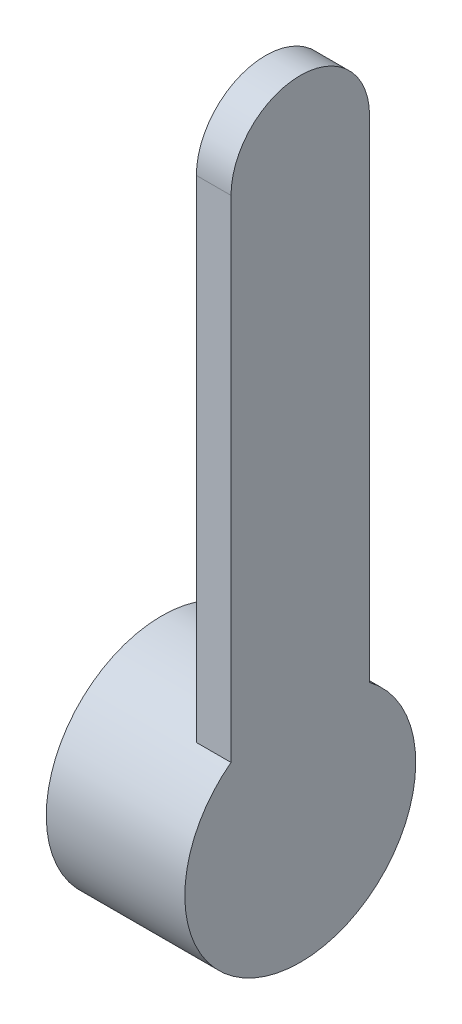
ISO-10303-21;
HEADER;
FILE_DESCRIPTION(('STEP AP214'),'2;1');
FILE_NAME('part.step','',(''),(''),'','','');
FILE_SCHEMA(('AUTOMOTIVE_DESIGN { 1 0 10303 214 1 1 1 1 }'));
ENDSEC;
DATA;
#1=APPLICATION_CONTEXT('core data for automotive mechanical design processes');
#2=APPLICATION_PROTOCOL_DEFINITION('international standard','automotive_design',2000,#1);
#3=PRODUCT_CONTEXT('',#1,'mechanical');
#4=PRODUCT('Part','Part','',(#3));
#5=PRODUCT_RELATED_PRODUCT_CATEGORY('part','',(#4));
#6=PRODUCT_DEFINITION_FORMATION('','',#4);
#7=PRODUCT_DEFINITION_CONTEXT('part definition',#1,'design');
#8=PRODUCT_DEFINITION('design','',#6,#7);
#9=PRODUCT_DEFINITION_SHAPE('','',#8);
#10=(LENGTH_UNIT() NAMED_UNIT(*) SI_UNIT(.MILLI.,.METRE.));
#11=(NAMED_UNIT(*) PLANE_ANGLE_UNIT() SI_UNIT($,.RADIAN.));
#12=(NAMED_UNIT(*) SI_UNIT($,.STERADIAN.) SOLID_ANGLE_UNIT());
#13=UNCERTAINTY_MEASURE_WITH_UNIT(LENGTH_MEASURE(1.E-05),#10,'distance_accuracy_value','');
#14=(GEOMETRIC_REPRESENTATION_CONTEXT(3) GLOBAL_UNCERTAINTY_ASSIGNED_CONTEXT((#13)) GLOBAL_UNIT_ASSIGNED_CONTEXT((#10,
#11,#12)) REPRESENTATION_CONTEXT('',''));
#15=CARTESIAN_POINT('',(0.,0.,0.));
#16=DIRECTION('',(0.,0.,1.));
#17=DIRECTION('',(1.,0.,0.));
#18=AXIS2_PLACEMENT_3D('',#15,#16,#17);
#19=CARTESIAN_POINT('',(3.,0.,0.));
#20=DIRECTION('',(-1.,0.,0.));
#21=DIRECTION('',(0.,0.,1.));
#22=AXIS2_PLACEMENT_3D('',#19,#20,#21);
#23=CYLINDRICAL_SURFACE('',#22,2.5);
#24=CARTESIAN_POINT('',(0.,0.,0.));
#25=DIRECTION('',(1.,0.,0.));
#26=DIRECTION('',(0.,0.,-1.));
#27=AXIS2_PLACEMENT_3D('',#24,#25,#26);
#28=CIRCLE('',#27,2.5);
#29=CARTESIAN_POINT('',(0.,0.,-2.5));
#30=VERTEX_POINT('',#29);
#31=EDGE_CURVE('E40',#30,#30,#28,.T.);
#32=ORIENTED_EDGE('',*,*,#31,.T.);
#33=EDGE_LOOP('',(#32));
#34=FACE_BOUND('',#33,.T.);
#35=CARTESIAN_POINT('',(2.25,0.,0.));
#36=DIRECTION('',(1.,0.,0.));
#37=DIRECTION('',(0.,0.,-1.));
#38=AXIS2_PLACEMENT_3D('',#35,#36,#37);
#39=CIRCLE('',#38,2.5);
#40=CARTESIAN_POINT('',(2.25,2.,-1.5));
#41=VERTEX_POINT('',#40);
#42=CARTESIAN_POINT('',(2.25,2.,1.5));
#43=VERTEX_POINT('',#42);
#44=EDGE_CURVE('E56',#41,#43,#39,.T.);
#45=ORIENTED_EDGE('',*,*,#44,.F.);
#46=DIRECTION('',(1.,0.,0.));
#47=VECTOR('',#46,1.);
#48=CARTESIAN_POINT('',(2.25,2.,-1.5));
#49=LINE('',#48,#47);
#50=CARTESIAN_POINT('',(3.,2.,-1.5));
#51=VERTEX_POINT('',#50);
#52=EDGE_CURVE('E77',#41,#51,#49,.T.);
#53=ORIENTED_EDGE('',*,*,#52,.T.);
#54=CARTESIAN_POINT('',(3.,0.,0.));
#55=DIRECTION('',(1.,0.,0.));
#56=DIRECTION('',(0.,0.,-1.));
#57=AXIS2_PLACEMENT_3D('',#54,#55,#56);
#58=CIRCLE('',#57,2.5);
#59=CARTESIAN_POINT('',(3.,2.,1.5));
#60=VERTEX_POINT('',#59);
#61=EDGE_CURVE('E11',#60,#51,#58,.T.);
#62=ORIENTED_EDGE('',*,*,#61,.F.);
#63=DIRECTION('',(1.,0.,0.));
#64=VECTOR('',#63,1.);
#65=CARTESIAN_POINT('',(2.25,2.,1.5));
#66=LINE('',#65,#64);
#67=EDGE_CURVE('E102',#43,#60,#66,.T.);
#68=ORIENTED_EDGE('',*,*,#67,.F.);
#69=EDGE_LOOP('',(#45,#53,#62,#68));
#70=FACE_BOUND('',#69,.T.);
#71=ADVANCED_FACE('F32',(#34,#70),#23,.T.);
#72=CARTESIAN_POINT('',(3.,0.,0.));
#73=DIRECTION('',(-1.,0.,0.));
#74=DIRECTION('',(0.,0.,1.));
#75=AXIS2_PLACEMENT_3D('',#72,#73,#74);
#76=CYLINDRICAL_SURFACE('',#75,1.5);
#77=CARTESIAN_POINT('',(0.,0.,0.));
#78=DIRECTION('',(1.,0.,0.));
#79=DIRECTION('',(0.,0.,-1.));
#80=AXIS2_PLACEMENT_3D('',#77,#78,#79);
#81=CIRCLE('',#80,1.5);
#82=CARTESIAN_POINT('',(0.,0.,-1.5));
#83=VERTEX_POINT('',#82);
#84=EDGE_CURVE('E107',#83,#83,#81,.T.);
#85=ORIENTED_EDGE('',*,*,#84,.F.);
#86=EDGE_LOOP('',(#85));
#87=FACE_BOUND('',#86,.T.);
#88=CARTESIAN_POINT('',(2.25,0.,0.));
#89=DIRECTION('',(1.,0.,0.));
#90=DIRECTION('',(0.,0.,-1.));
#91=AXIS2_PLACEMENT_3D('',#88,#89,#90);
#92=CIRCLE('',#91,1.5);
#93=CARTESIAN_POINT('',(2.25,0.,-1.5));
#94=VERTEX_POINT('',#93);
#95=EDGE_CURVE('E35',#94,#94,#92,.T.);
#96=ORIENTED_EDGE('',*,*,#95,.T.);
#97=EDGE_LOOP('',(#96));
#98=FACE_BOUND('',#97,.T.);
#99=ADVANCED_FACE('F121',(#87,#98),#76,.F.);
#100=CARTESIAN_POINT('',(3.,0.,0.));
#101=DIRECTION('',(1.,0.,0.));
#102=DIRECTION('',(0.,0.,-1.));
#103=AXIS2_PLACEMENT_3D('',#100,#101,#102);
#104=PLANE('',#103);
#105=ORIENTED_EDGE('',*,*,#61,.T.);
#106=DIRECTION('',(0.,1.,0.));
#107=VECTOR('',#106,1.);
#108=CARTESIAN_POINT('',(3.,2.,-1.5));
#109=LINE('',#108,#107);
#110=CARTESIAN_POINT('',(3.,12.632795692366,-1.5));
#111=VERTEX_POINT('',#110);
#112=EDGE_CURVE('E99',#51,#111,#109,.T.);
#113=ORIENTED_EDGE('',*,*,#112,.T.);
#114=CARTESIAN_POINT('',(3.,12.632795692366,0.));
#115=DIRECTION('',(-1.,0.,0.));
#116=DIRECTION('',(0.,0.,1.));
#117=AXIS2_PLACEMENT_3D('',#114,#115,#116);
#118=CIRCLE('',#117,1.5);
#119=CARTESIAN_POINT('',(3.,12.632795692366,1.5));
#120=VERTEX_POINT('',#119);
#121=EDGE_CURVE('E90',#120,#111,#118,.T.);
#122=ORIENTED_EDGE('',*,*,#121,.F.);
#123=DIRECTION('',(0.,1.,0.));
#124=VECTOR('',#123,1.);
#125=CARTESIAN_POINT('',(3.,2.,1.5));
#126=LINE('',#125,#124);
#127=EDGE_CURVE('E47',#60,#120,#126,.T.);
#128=ORIENTED_EDGE('',*,*,#127,.F.);
#129=EDGE_LOOP('',(#105,#113,#122,#128));
#130=FACE_BOUND('',#129,.T.);
#131=ADVANCED_FACE('F118',(#130),#104,.T.);
#132=CARTESIAN_POINT('',(0.,0.,0.));
#133=DIRECTION('',(1.,0.,0.));
#134=DIRECTION('',(0.,0.,-1.));
#135=AXIS2_PLACEMENT_3D('',#132,#133,#134);
#136=PLANE('',#135);
#137=ORIENTED_EDGE('',*,*,#31,.F.);
#138=EDGE_LOOP('',(#137));
#139=FACE_BOUND('',#138,.T.);
#140=ORIENTED_EDGE('',*,*,#84,.T.);
#141=EDGE_LOOP('',(#140));
#142=FACE_BOUND('',#141,.T.);
#143=ADVANCED_FACE('F114',(#139,#142),#136,.F.);
#144=CARTESIAN_POINT('',(2.25,-1.23328864481964E-10,0.));
#145=DIRECTION('',(1.,0.,0.));
#146=DIRECTION('',(0.,0.,-1.));
#147=AXIS2_PLACEMENT_3D('',#144,#145,#146);
#148=PLANE('',#147);
#149=ORIENTED_EDGE('',*,*,#95,.F.);
#150=EDGE_LOOP('',(#149));
#151=FACE_BOUND('',#150,.T.);
#152=ADVANCED_FACE('F117',(#151),#148,.F.);
#153=CARTESIAN_POINT('',(2.25,2.,1.5));
#154=DIRECTION('',(0.,0.,-1.));
#155=DIRECTION('',(0.,1.,0.));
#156=AXIS2_PLACEMENT_3D('',#153,#154,#155);
#157=PLANE('',#156);
#158=ORIENTED_EDGE('',*,*,#127,.T.);
#159=DIRECTION('',(1.,0.,0.));
#160=VECTOR('',#159,1.);
#161=CARTESIAN_POINT('',(2.25,12.632795692366,1.5));
#162=LINE('',#161,#160);
#163=CARTESIAN_POINT('',(2.25,12.632795692366,1.5));
#164=VERTEX_POINT('',#163);
#165=EDGE_CURVE('E92',#164,#120,#162,.T.);
#166=ORIENTED_EDGE('',*,*,#165,.F.);
#167=DIRECTION('',(0.,1.,0.));
#168=VECTOR('',#167,1.);
#169=CARTESIAN_POINT('',(2.25,2.,1.5));
#170=LINE('',#169,#168);
#171=EDGE_CURVE('E84',#43,#164,#170,.T.);
#172=ORIENTED_EDGE('',*,*,#171,.F.);
#173=ORIENTED_EDGE('',*,*,#67,.T.);
#174=EDGE_LOOP('',(#158,#166,#172,#173));
#175=FACE_BOUND('',#174,.T.);
#176=ADVANCED_FACE('F129',(#175),#157,.F.);
#177=CARTESIAN_POINT('',(2.25,12.632795692366,0.));
#178=DIRECTION('',(1.,0.,0.));
#179=DIRECTION('',(0.,0.,-1.));
#180=AXIS2_PLACEMENT_3D('',#177,#178,#179);
#181=CYLINDRICAL_SURFACE('',#180,1.5);
#182=ORIENTED_EDGE('',*,*,#121,.T.);
#183=DIRECTION('',(1.,0.,0.));
#184=VECTOR('',#183,1.);
#185=CARTESIAN_POINT('',(2.25,12.632795692366,-1.5));
#186=LINE('',#185,#184);
#187=CARTESIAN_POINT('',(2.25,12.632795692366,-1.5));
#188=VERTEX_POINT('',#187);
#189=EDGE_CURVE('E88',#188,#111,#186,.T.);
#190=ORIENTED_EDGE('',*,*,#189,.F.);
#191=CARTESIAN_POINT('',(2.25,12.632795692366,0.));
#192=DIRECTION('',(-1.,0.,0.));
#193=DIRECTION('',(0.,0.,1.));
#194=AXIS2_PLACEMENT_3D('',#191,#192,#193);
#195=CIRCLE('',#194,1.5);
#196=EDGE_CURVE('E80',#164,#188,#195,.T.);
#197=ORIENTED_EDGE('',*,*,#196,.F.);
#198=ORIENTED_EDGE('',*,*,#165,.T.);
#199=EDGE_LOOP('',(#182,#190,#197,#198));
#200=FACE_BOUND('',#199,.T.);
#201=ADVANCED_FACE('F89',(#200),#181,.T.);
#202=CARTESIAN_POINT('',(2.25,2.,-1.5));
#203=DIRECTION('',(0.,0.,-1.));
#204=DIRECTION('',(0.,1.,0.));
#205=AXIS2_PLACEMENT_3D('',#202,#203,#204);
#206=PLANE('',#205);
#207=ORIENTED_EDGE('',*,*,#112,.F.);
#208=ORIENTED_EDGE('',*,*,#52,.F.);
#209=DIRECTION('',(0.,1.,0.));
#210=VECTOR('',#209,1.);
#211=CARTESIAN_POINT('',(2.25,2.,-1.5));
#212=LINE('',#211,#210);
#213=EDGE_CURVE('E83',#41,#188,#212,.T.);
#214=ORIENTED_EDGE('',*,*,#213,.T.);
#215=ORIENTED_EDGE('',*,*,#189,.T.);
#216=EDGE_LOOP('',(#207,#208,#214,#215));
#217=FACE_BOUND('',#216,.T.);
#218=ADVANCED_FACE('F94',(#217),#206,.T.);
#219=ORIENTED_EDGE('',*,*,#213,.F.);
#220=ORIENTED_EDGE('',*,*,#44,.T.);
#221=ORIENTED_EDGE('',*,*,#171,.T.);
#222=ORIENTED_EDGE('',*,*,#196,.T.);
#223=EDGE_LOOP('',(#219,#220,#221,#222));
#224=FACE_BOUND('',#223,.T.);
#225=ADVANCED_FACE('F82',(#224),#148,.F.);
#226=CLOSED_SHELL('',(#71,#99,#131,#143,#152,#176,#201,#218,#225));
#227=MANIFOLD_SOLID_BREP('B2',#226);
#228=ADVANCED_BREP_SHAPE_REPRESENTATION('',(#18,#227),#14);
#229=SHAPE_DEFINITION_REPRESENTATION(#9,#228);
ENDSEC;
END-ISO-10303-21;
